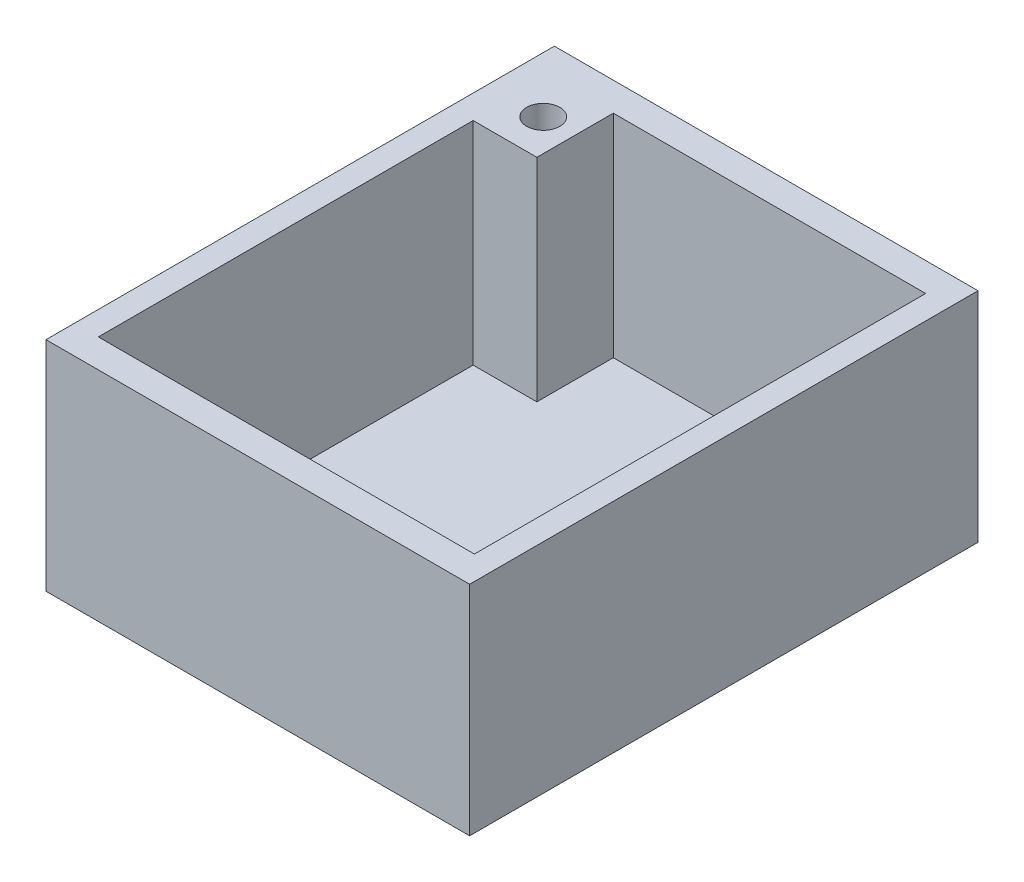
ISO-10303-21;
HEADER;
FILE_DESCRIPTION(('STEP AP214'),'2;1');
FILE_NAME('part.step','',(''),(''),'','','');
FILE_SCHEMA(('AUTOMOTIVE_DESIGN { 1 0 10303 214 1 1 1 1 }'));
ENDSEC;
DATA;
#1=APPLICATION_CONTEXT('core data for automotive mechanical design processes');
#2=APPLICATION_PROTOCOL_DEFINITION('international standard','automotive_design',2000,#1);
#3=PRODUCT_CONTEXT('',#1,'mechanical');
#4=PRODUCT('Part','Part','',(#3));
#5=PRODUCT_RELATED_PRODUCT_CATEGORY('part','',(#4));
#6=PRODUCT_DEFINITION_FORMATION('','',#4);
#7=PRODUCT_DEFINITION_CONTEXT('part definition',#1,'design');
#8=PRODUCT_DEFINITION('design','',#6,#7);
#9=PRODUCT_DEFINITION_SHAPE('','',#8);
#10=(LENGTH_UNIT() NAMED_UNIT(*) SI_UNIT(.MILLI.,.METRE.));
#11=(NAMED_UNIT(*) PLANE_ANGLE_UNIT() SI_UNIT($,.RADIAN.));
#12=(NAMED_UNIT(*) SI_UNIT($,.STERADIAN.) SOLID_ANGLE_UNIT());
#13=UNCERTAINTY_MEASURE_WITH_UNIT(LENGTH_MEASURE(1.E-05),#10,'distance_accuracy_value','');
#14=(GEOMETRIC_REPRESENTATION_CONTEXT(3) GLOBAL_UNCERTAINTY_ASSIGNED_CONTEXT((#13)) GLOBAL_UNIT_ASSIGNED_CONTEXT((#10,
#11,#12)) REPRESENTATION_CONTEXT('',''));
#15=CARTESIAN_POINT('',(0.,0.,0.));
#16=DIRECTION('',(0.,0.,1.));
#17=DIRECTION('',(1.,0.,0.));
#18=AXIS2_PLACEMENT_3D('',#15,#16,#17);
#19=CARTESIAN_POINT('',(50.0241053574372,25.,0.));
#20=DIRECTION('',(1.,0.,0.));
#21=DIRECTION('',(0.,0.,-1.));
#22=AXIS2_PLACEMENT_3D('',#19,#20,#21);
#23=PLANE('',#22);
#24=DIRECTION('',(0.,-1.,0.));
#25=VECTOR('',#24,1.);
#26=CARTESIAN_POINT('',(50.0241053574372,25.,-0.00763533452678711));
#27=LINE('',#26,#25);
#28=CARTESIAN_POINT('',(50.0241053574372,25.,-0.00763533452678711));
#29=VERTEX_POINT('',#28);
#30=CARTESIAN_POINT('',(50.0241053574372,-0.71688370709111,-0.00763533452678711));
#31=VERTEX_POINT('',#30);
#32=EDGE_CURVE('E197',#29,#31,#27,.T.);
#33=ORIENTED_EDGE('',*,*,#32,.T.);
#34=DIRECTION('',(0.,0.,1.));
#35=VECTOR('',#34,1.);
#36=CARTESIAN_POINT('',(50.0241053574372,-0.71688370709111,-60.0076353345268));
#37=LINE('',#36,#35);
#38=CARTESIAN_POINT('',(50.0241053574372,-0.71688370709111,-60.0076353345268));
#39=VERTEX_POINT('',#38);
#40=EDGE_CURVE('E144',#39,#31,#37,.T.);
#41=ORIENTED_EDGE('',*,*,#40,.F.);
#42=DIRECTION('',(0.,-1.,0.));
#43=VECTOR('',#42,1.);
#44=CARTESIAN_POINT('',(50.0241053574372,25.,-60.0076353345268));
#45=LINE('',#44,#43);
#46=CARTESIAN_POINT('',(50.0241053574372,25.,-60.0076353345268));
#47=VERTEX_POINT('',#46);
#48=EDGE_CURVE('E13',#47,#39,#45,.T.);
#49=ORIENTED_EDGE('',*,*,#48,.F.);
#50=DIRECTION('',(0.,0.,1.));
#51=VECTOR('',#50,1.);
#52=CARTESIAN_POINT('',(50.0241053574372,25.,0.));
#53=LINE('',#52,#51);
#54=EDGE_CURVE('E173',#47,#29,#53,.T.);
#55=ORIENTED_EDGE('',*,*,#54,.T.);
#56=EDGE_LOOP('',(#33,#41,#49,#55));
#57=FACE_BOUND('',#56,.T.);
#58=ADVANCED_FACE('F51',(#57),#23,.T.);
#59=CARTESIAN_POINT('',(0.,25.,-60.0076353345268));
#60=DIRECTION('',(0.,0.,-1.));
#61=DIRECTION('',(-1.,0.,0.));
#62=AXIS2_PLACEMENT_3D('',#59,#60,#61);
#63=PLANE('',#62);
#64=ORIENTED_EDGE('',*,*,#48,.T.);
#65=DIRECTION('',(1.,0.,0.));
#66=VECTOR('',#65,1.);
#67=CARTESIAN_POINT('',(0.0241053574371627,-0.71688370709111,-60.0076353345268));
#68=LINE('',#67,#66);
#69=CARTESIAN_POINT('',(0.0241053574371627,-0.71688370709111,-60.0076353345268));
#70=VERTEX_POINT('',#69);
#71=EDGE_CURVE('E141',#70,#39,#68,.T.);
#72=ORIENTED_EDGE('',*,*,#71,.F.);
#73=DIRECTION('',(0.,-1.,0.));
#74=VECTOR('',#73,1.);
#75=CARTESIAN_POINT('',(0.0241053574371553,25.,-60.0076353345268));
#76=LINE('',#75,#74);
#77=CARTESIAN_POINT('',(0.0241053574371553,25.,-60.0076353345268));
#78=VERTEX_POINT('',#77);
#79=EDGE_CURVE('E61',#78,#70,#76,.T.);
#80=ORIENTED_EDGE('',*,*,#79,.F.);
#81=DIRECTION('',(1.,0.,0.));
#82=VECTOR('',#81,1.);
#83=CARTESIAN_POINT('',(0.,25.,-60.0076353345268));
#84=LINE('',#83,#82);
#85=EDGE_CURVE('E176',#78,#47,#84,.T.);
#86=ORIENTED_EDGE('',*,*,#85,.T.);
#87=EDGE_LOOP('',(#64,#72,#80,#86));
#88=FACE_BOUND('',#87,.T.);
#89=ADVANCED_FACE('F146',(#88),#63,.T.);
#90=CARTESIAN_POINT('',(0.0241053574371627,25.,0.));
#91=DIRECTION('',(1.,0.,0.));
#92=DIRECTION('',(0.,0.,-1.));
#93=AXIS2_PLACEMENT_3D('',#90,#91,#92);
#94=PLANE('',#93);
#95=ORIENTED_EDGE('',*,*,#79,.T.);
#96=DIRECTION('',(0.,0.,1.));
#97=VECTOR('',#96,1.);
#98=CARTESIAN_POINT('',(0.0241053574371627,-0.71688370709111,-60.0076353345268));
#99=LINE('',#98,#97);
#100=CARTESIAN_POINT('',(0.0241053574371627,-0.71688370709111,-0.00763533452678711));
#101=VERTEX_POINT('',#100);
#102=EDGE_CURVE('E128',#70,#101,#99,.T.);
#103=ORIENTED_EDGE('',*,*,#102,.T.);
#104=DIRECTION('',(0.,-1.,0.));
#105=VECTOR('',#104,1.);
#106=CARTESIAN_POINT('',(0.0241053574371627,25.,-0.00763533452678711));
#107=LINE('',#106,#105);
#108=CARTESIAN_POINT('',(0.0241053574371627,25.,-0.00763533452678711));
#109=VERTEX_POINT('',#108);
#110=EDGE_CURVE('E135',#109,#101,#107,.T.);
#111=ORIENTED_EDGE('',*,*,#110,.F.);
#112=DIRECTION('',(0.,0.,1.));
#113=VECTOR('',#112,1.);
#114=CARTESIAN_POINT('',(0.0241053574371627,25.,0.));
#115=LINE('',#114,#113);
#116=EDGE_CURVE('E130',#78,#109,#115,.T.);
#117=ORIENTED_EDGE('',*,*,#116,.F.);
#118=EDGE_LOOP('',(#95,#103,#111,#117));
#119=FACE_BOUND('',#118,.T.);
#120=ADVANCED_FACE('F126',(#119),#94,.F.);
#121=CARTESIAN_POINT('',(10.3517843984044,25.,0.));
#122=DIRECTION('',(-1.,0.,0.));
#123=DIRECTION('',(0.,0.,1.));
#124=AXIS2_PLACEMENT_3D('',#121,#122,#123);
#125=PLANE('',#124);
#126=DIRECTION('',(0.,0.,-1.));
#127=VECTOR('',#126,1.);
#128=CARTESIAN_POINT('',(10.3517843984044,0.,0.));
#129=LINE('',#128,#127);
#130=CARTESIAN_POINT('',(10.3517843984043,0.,-47.6144204853662));
#131=VERTEX_POINT('',#130);
#132=CARTESIAN_POINT('',(10.3517843984043,0.,-56.6384672247671));
#133=VERTEX_POINT('',#132);
#134=EDGE_CURVE('E151',#131,#133,#129,.T.);
#135=ORIENTED_EDGE('',*,*,#134,.T.);
#136=DIRECTION('',(0.,-1.,0.));
#137=VECTOR('',#136,1.);
#138=CARTESIAN_POINT('',(10.3517843984043,25.,-56.6384672247671));
#139=LINE('',#138,#137);
#140=CARTESIAN_POINT('',(10.3517843984043,25.,-56.6384672247671));
#141=VERTEX_POINT('',#140);
#142=EDGE_CURVE('E55',#141,#133,#139,.T.);
#143=ORIENTED_EDGE('',*,*,#142,.F.);
#144=DIRECTION('',(0.,0.,-1.));
#145=VECTOR('',#144,1.);
#146=CARTESIAN_POINT('',(10.3517843984044,25.,0.));
#147=LINE('',#146,#145);
#148=CARTESIAN_POINT('',(10.3517843984043,25.,-47.6144204853662));
#149=VERTEX_POINT('',#148);
#150=EDGE_CURVE('E153',#149,#141,#147,.T.);
#151=ORIENTED_EDGE('',*,*,#150,.F.);
#152=DIRECTION('',(0.,-1.,0.));
#153=VECTOR('',#152,1.);
#154=CARTESIAN_POINT('',(10.3517843984043,25.,-47.6144204853662));
#155=LINE('',#154,#153);
#156=EDGE_CURVE('E180',#149,#131,#155,.T.);
#157=ORIENTED_EDGE('',*,*,#156,.T.);
#158=EDGE_LOOP('',(#135,#143,#151,#157));
#159=FACE_BOUND('',#158,.T.);
#160=ADVANCED_FACE('F53',(#159),#125,.F.);
#161=CARTESIAN_POINT('',(0.,25.,-56.6384672247671));
#162=DIRECTION('',(0.,0.,-1.));
#163=DIRECTION('',(-1.,0.,0.));
#164=AXIS2_PLACEMENT_3D('',#161,#162,#163);
#165=PLANE('',#164);
#166=DIRECTION('',(1.,0.,0.));
#167=VECTOR('',#166,1.);
#168=CARTESIAN_POINT('',(0.,0.,-56.6384672247671));
#169=LINE('',#168,#167);
#170=CARTESIAN_POINT('',(47.2164652659708,0.,-56.6384672247671));
#171=VERTEX_POINT('',#170);
#172=EDGE_CURVE('E183',#133,#171,#169,.T.);
#173=ORIENTED_EDGE('',*,*,#172,.T.);
#174=DIRECTION('',(0.,-1.,0.));
#175=VECTOR('',#174,1.);
#176=CARTESIAN_POINT('',(47.2164652659708,25.,-56.6384672247671));
#177=LINE('',#176,#175);
#178=CARTESIAN_POINT('',(47.2164652659708,25.,-56.6384672247671));
#179=VERTEX_POINT('',#178);
#180=EDGE_CURVE('E210',#179,#171,#177,.T.);
#181=ORIENTED_EDGE('',*,*,#180,.F.);
#182=DIRECTION('',(1.,0.,0.));
#183=VECTOR('',#182,1.);
#184=CARTESIAN_POINT('',(0.,25.,-56.6384672247671));
#185=LINE('',#184,#183);
#186=EDGE_CURVE('E156',#141,#179,#185,.T.);
#187=ORIENTED_EDGE('',*,*,#186,.F.);
#188=ORIENTED_EDGE('',*,*,#142,.T.);
#189=EDGE_LOOP('',(#173,#181,#187,#188));
#190=FACE_BOUND('',#189,.T.);
#191=ADVANCED_FACE('F218',(#190),#165,.F.);
#192=CARTESIAN_POINT('',(47.2164652659708,25.,0.));
#193=DIRECTION('',(1.,0.,0.));
#194=DIRECTION('',(0.,0.,-1.));
#195=AXIS2_PLACEMENT_3D('',#192,#193,#194);
#196=PLANE('',#195);
#197=DIRECTION('',(0.,0.,1.));
#198=VECTOR('',#197,1.);
#199=CARTESIAN_POINT('',(47.2164652659708,0.,0.));
#200=LINE('',#199,#198);
#201=CARTESIAN_POINT('',(47.2164652659708,0.,-3.37680344428644));
#202=VERTEX_POINT('',#201);
#203=EDGE_CURVE('E186',#171,#202,#200,.T.);
#204=ORIENTED_EDGE('',*,*,#203,.T.);
#205=DIRECTION('',(0.,-1.,0.));
#206=VECTOR('',#205,1.);
#207=CARTESIAN_POINT('',(47.2164652659708,25.,-3.37680344428644));
#208=LINE('',#207,#206);
#209=CARTESIAN_POINT('',(47.2164652659708,25.,-3.37680344428644));
#210=VERTEX_POINT('',#209);
#211=EDGE_CURVE('E208',#210,#202,#208,.T.);
#212=ORIENTED_EDGE('',*,*,#211,.F.);
#213=DIRECTION('',(0.,0.,1.));
#214=VECTOR('',#213,1.);
#215=CARTESIAN_POINT('',(47.2164652659708,25.,0.));
#216=LINE('',#215,#214);
#217=EDGE_CURVE('E159',#179,#210,#216,.T.);
#218=ORIENTED_EDGE('',*,*,#217,.F.);
#219=ORIENTED_EDGE('',*,*,#180,.T.);
#220=EDGE_LOOP('',(#204,#212,#218,#219));
#221=FACE_BOUND('',#220,.T.);
#222=ADVANCED_FACE('F227',(#221),#196,.F.);
#223=CARTESIAN_POINT('',(0.,25.,-3.37680344428644));
#224=DIRECTION('',(0.,0.,-1.));
#225=DIRECTION('',(-1.,0.,0.));
#226=AXIS2_PLACEMENT_3D('',#223,#224,#225);
#227=PLANE('',#226);
#228=DIRECTION('',(1.,0.,0.));
#229=VECTOR('',#228,1.);
#230=CARTESIAN_POINT('',(0.,0.,-3.37680344428644));
#231=LINE('',#230,#229);
#232=CARTESIAN_POINT('',(2.83174544890355,0.,-3.37680344428644));
#233=VERTEX_POINT('',#232);
#234=EDGE_CURVE('E189',#233,#202,#231,.T.);
#235=ORIENTED_EDGE('',*,*,#234,.F.);
#236=DIRECTION('',(0.,-1.,0.));
#237=VECTOR('',#236,1.);
#238=CARTESIAN_POINT('',(2.83174544890355,25.,-3.37680344428644));
#239=LINE('',#238,#237);
#240=CARTESIAN_POINT('',(2.83174544890355,25.,-3.37680344428644));
#241=VERTEX_POINT('',#240);
#242=EDGE_CURVE('E205',#241,#233,#239,.T.);
#243=ORIENTED_EDGE('',*,*,#242,.F.);
#244=DIRECTION('',(1.,0.,0.));
#245=VECTOR('',#244,1.);
#246=CARTESIAN_POINT('',(0.,25.,-3.37680344428644));
#247=LINE('',#246,#245);
#248=EDGE_CURVE('E161',#241,#210,#247,.T.);
#249=ORIENTED_EDGE('',*,*,#248,.T.);
#250=ORIENTED_EDGE('',*,*,#211,.T.);
#251=EDGE_LOOP('',(#235,#243,#249,#250));
#252=FACE_BOUND('',#251,.T.);
#253=ADVANCED_FACE('F230',(#252),#227,.T.);
#254=CARTESIAN_POINT('',(2.83174544890355,25.,0.));
#255=DIRECTION('',(1.,0.,0.));
#256=DIRECTION('',(0.,0.,-1.));
#257=AXIS2_PLACEMENT_3D('',#254,#255,#256);
#258=PLANE('',#257);
#259=DIRECTION('',(0.,0.,1.));
#260=VECTOR('',#259,1.);
#261=CARTESIAN_POINT('',(2.83174544890355,0.,0.));
#262=LINE('',#261,#260);
#263=CARTESIAN_POINT('',(2.83174544890355,0.,-47.6144204853662));
#264=VERTEX_POINT('',#263);
#265=EDGE_CURVE('E191',#264,#233,#262,.T.);
#266=ORIENTED_EDGE('',*,*,#265,.F.);
#267=DIRECTION('',(0.,-1.,0.));
#268=VECTOR('',#267,1.);
#269=CARTESIAN_POINT('',(2.83174544890355,25.,-47.6144204853662));
#270=LINE('',#269,#268);
#271=CARTESIAN_POINT('',(2.83174544890355,25.,-47.6144204853662));
#272=VERTEX_POINT('',#271);
#273=EDGE_CURVE('E202',#272,#264,#270,.T.);
#274=ORIENTED_EDGE('',*,*,#273,.F.);
#275=DIRECTION('',(0.,0.,1.));
#276=VECTOR('',#275,1.);
#277=CARTESIAN_POINT('',(2.83174544890355,25.,0.));
#278=LINE('',#277,#276);
#279=EDGE_CURVE('E164',#272,#241,#278,.T.);
#280=ORIENTED_EDGE('',*,*,#279,.T.);
#281=ORIENTED_EDGE('',*,*,#242,.T.);
#282=EDGE_LOOP('',(#266,#274,#280,#281));
#283=FACE_BOUND('',#282,.T.);
#284=ADVANCED_FACE('F238',(#283),#258,.T.);
#285=CARTESIAN_POINT('',(6.59176492365393,25.,-52.1264438550666));
#286=DIRECTION('',(0.,-1.,0.));
#287=DIRECTION('',(0.,0.,-1.));
#288=AXIS2_PLACEMENT_3D('',#285,#286,#287);
#289=CYLINDRICAL_SURFACE('',#288,1.95347229631525);
#290=CARTESIAN_POINT('',(6.59176492365393,25.,-52.1264438550666));
#291=DIRECTION('',(0.,1.,0.));
#292=DIRECTION('',(0.,0.,1.));
#293=AXIS2_PLACEMENT_3D('',#290,#291,#292);
#294=CIRCLE('',#293,1.95347229631525);
#295=CARTESIAN_POINT('',(6.59176492365393,25.,-50.1729715587514));
#296=VERTEX_POINT('',#295);
#297=EDGE_CURVE('E170',#296,#296,#294,.T.);
#298=ORIENTED_EDGE('',*,*,#297,.T.);
#299=EDGE_LOOP('',(#298));
#300=FACE_BOUND('',#299,.T.);
#301=CARTESIAN_POINT('',(6.59176492365393,0.,-52.1264438550666));
#302=DIRECTION('',(0.,1.,0.));
#303=DIRECTION('',(0.,0.,1.));
#304=AXIS2_PLACEMENT_3D('',#301,#302,#303);
#305=CIRCLE('',#304,1.95347229631525);
#306=CARTESIAN_POINT('',(6.59176492365393,0.,-50.1729715587514));
#307=VERTEX_POINT('',#306);
#308=EDGE_CURVE('E157',#307,#307,#305,.T.);
#309=ORIENTED_EDGE('',*,*,#308,.F.);
#310=EDGE_LOOP('',(#309));
#311=FACE_BOUND('',#310,.T.);
#312=ADVANCED_FACE('F243',(#300,#311),#289,.F.);
#313=CARTESIAN_POINT('',(0.,25.,-47.6144204853662));
#314=DIRECTION('',(0.,0.,1.));
#315=DIRECTION('',(1.,0.,0.));
#316=AXIS2_PLACEMENT_3D('',#313,#314,#315);
#317=PLANE('',#316);
#318=DIRECTION('',(-1.,0.,0.));
#319=VECTOR('',#318,1.);
#320=CARTESIAN_POINT('',(0.,0.,-47.6144204853662));
#321=LINE('',#320,#319);
#322=EDGE_CURVE('E193',#131,#264,#321,.T.);
#323=ORIENTED_EDGE('',*,*,#322,.F.);
#324=ORIENTED_EDGE('',*,*,#156,.F.);
#325=DIRECTION('',(-1.,0.,0.));
#326=VECTOR('',#325,1.);
#327=CARTESIAN_POINT('',(0.,25.,-47.6144204853662));
#328=LINE('',#327,#326);
#329=EDGE_CURVE('E167',#149,#272,#328,.T.);
#330=ORIENTED_EDGE('',*,*,#329,.T.);
#331=ORIENTED_EDGE('',*,*,#273,.T.);
#332=EDGE_LOOP('',(#323,#324,#330,#331));
#333=FACE_BOUND('',#332,.T.);
#334=ADVANCED_FACE('F240',(#333),#317,.T.);
#335=CARTESIAN_POINT('',(0.,25.,-0.00763533452678711));
#336=DIRECTION('',(0.,0.,-1.));
#337=DIRECTION('',(-1.,0.,0.));
#338=AXIS2_PLACEMENT_3D('',#335,#336,#337);
#339=PLANE('',#338);
#340=ORIENTED_EDGE('',*,*,#110,.T.);
#341=DIRECTION('',(1.,0.,0.));
#342=VECTOR('',#341,1.);
#343=CARTESIAN_POINT('',(0.0241053574371627,-0.71688370709111,-0.00763533452678711));
#344=LINE('',#343,#342);
#345=EDGE_CURVE('E143',#101,#31,#344,.T.);
#346=ORIENTED_EDGE('',*,*,#345,.T.);
#347=ORIENTED_EDGE('',*,*,#32,.F.);
#348=DIRECTION('',(1.,0.,0.));
#349=VECTOR('',#348,1.);
#350=CARTESIAN_POINT('',(0.,25.,-0.00763533452678711));
#351=LINE('',#350,#349);
#352=EDGE_CURVE('E69',#109,#29,#351,.T.);
#353=ORIENTED_EDGE('',*,*,#352,.F.);
#354=EDGE_LOOP('',(#340,#346,#347,#353));
#355=FACE_BOUND('',#354,.T.);
#356=ADVANCED_FACE('F242',(#355),#339,.F.);
#357=CARTESIAN_POINT('',(0.,25.,0.));
#358=DIRECTION('',(0.,1.,0.));
#359=DIRECTION('',(0.,0.,1.));
#360=AXIS2_PLACEMENT_3D('',#357,#358,#359);
#361=PLANE('',#360);
#362=ORIENTED_EDGE('',*,*,#150,.T.);
#363=ORIENTED_EDGE('',*,*,#186,.T.);
#364=ORIENTED_EDGE('',*,*,#217,.T.);
#365=ORIENTED_EDGE('',*,*,#248,.F.);
#366=ORIENTED_EDGE('',*,*,#279,.F.);
#367=ORIENTED_EDGE('',*,*,#329,.F.);
#368=EDGE_LOOP('',(#362,#363,#364,#365,#366,#367));
#369=FACE_BOUND('',#368,.T.);
#370=ORIENTED_EDGE('',*,*,#297,.F.);
#371=EDGE_LOOP('',(#370));
#372=FACE_BOUND('',#371,.T.);
#373=ORIENTED_EDGE('',*,*,#54,.F.);
#374=ORIENTED_EDGE('',*,*,#85,.F.);
#375=ORIENTED_EDGE('',*,*,#116,.T.);
#376=ORIENTED_EDGE('',*,*,#352,.T.);
#377=EDGE_LOOP('',(#373,#374,#375,#376));
#378=FACE_BOUND('',#377,.T.);
#379=ADVANCED_FACE('F233',(#369,#372,#378),#361,.T.);
#380=CARTESIAN_POINT('',(0.0241053574371627,0.,-60.0076353345268));
#381=DIRECTION('',(0.,1.,0.));
#382=DIRECTION('',(0.,0.,1.));
#383=AXIS2_PLACEMENT_3D('',#380,#381,#382);
#384=PLANE('',#383);
#385=ORIENTED_EDGE('',*,*,#308,.T.);
#386=EDGE_LOOP('',(#385));
#387=FACE_BOUND('',#386,.T.);
#388=ADVANCED_FACE('F266',(#387),#384,.T.);
#389=ORIENTED_EDGE('',*,*,#134,.F.);
#390=ORIENTED_EDGE('',*,*,#322,.T.);
#391=ORIENTED_EDGE('',*,*,#265,.T.);
#392=ORIENTED_EDGE('',*,*,#234,.T.);
#393=ORIENTED_EDGE('',*,*,#203,.F.);
#394=ORIENTED_EDGE('',*,*,#172,.F.);
#395=EDGE_LOOP('',(#389,#390,#391,#392,#393,#394));
#396=FACE_BOUND('',#395,.T.);
#397=ADVANCED_FACE('F223',(#396),#384,.T.);
#398=CARTESIAN_POINT('',(0.0241053574371627,-0.71688370709111,-60.0076353345268));
#399=DIRECTION('',(0.,-1.,0.));
#400=DIRECTION('',(0.,0.,-1.));
#401=AXIS2_PLACEMENT_3D('',#398,#399,#400);
#402=PLANE('',#401);
#403=ORIENTED_EDGE('',*,*,#345,.F.);
#404=ORIENTED_EDGE('',*,*,#102,.F.);
#405=ORIENTED_EDGE('',*,*,#71,.T.);
#406=ORIENTED_EDGE('',*,*,#40,.T.);
#407=EDGE_LOOP('',(#403,#404,#405,#406));
#408=FACE_BOUND('',#407,.T.);
#409=ADVANCED_FACE('F139',(#408),#402,.T.);
#410=CLOSED_SHELL('',(#58,#89,#120,#160,#191,#222,#253,#284,#312,#334,#356,#379,#388,#397,#409));
#411=MANIFOLD_SOLID_BREP('B2',#410);
#412=ADVANCED_BREP_SHAPE_REPRESENTATION('',(#18,#411),#14);
#413=SHAPE_DEFINITION_REPRESENTATION(#9,#412);
ENDSEC;
END-ISO-10303-21;
